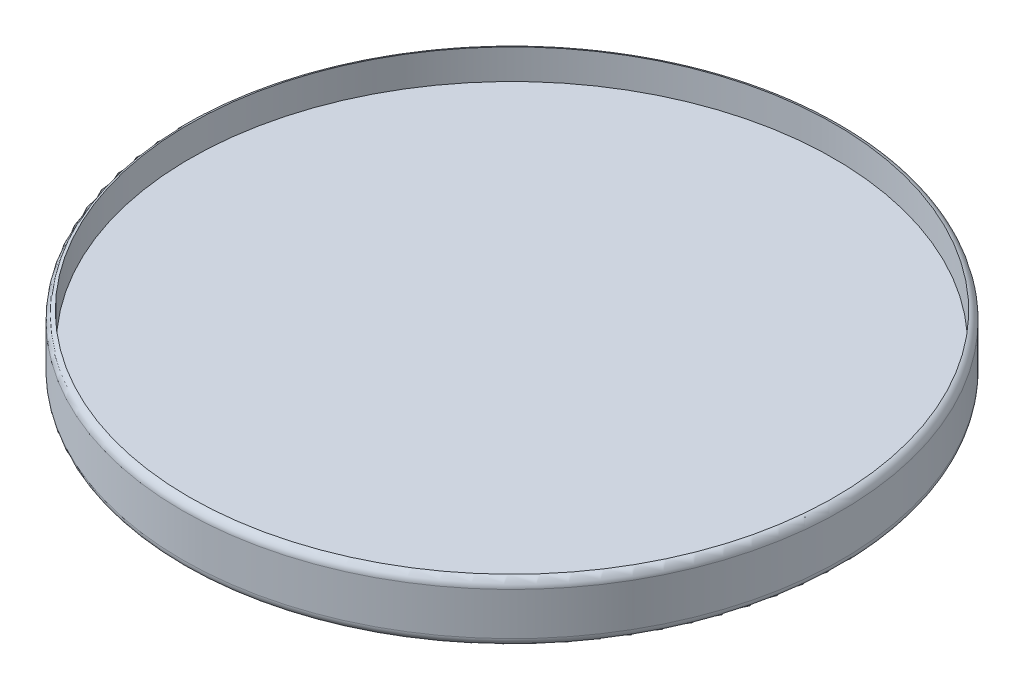
ISO-10303-21;
HEADER;
FILE_DESCRIPTION(('STEP AP214'),'2;1');
FILE_NAME('part.step','',(''),(''),'','','');
FILE_SCHEMA(('AUTOMOTIVE_DESIGN { 1 0 10303 214 1 1 1 1 }'));
ENDSEC;
DATA;
#1=APPLICATION_CONTEXT('core data for automotive mechanical design processes');
#2=APPLICATION_PROTOCOL_DEFINITION('international standard','automotive_design',2000,#1);
#3=PRODUCT_CONTEXT('',#1,'mechanical');
#4=PRODUCT('Part','Part','',(#3));
#5=PRODUCT_RELATED_PRODUCT_CATEGORY('part','',(#4));
#6=PRODUCT_DEFINITION_FORMATION('','',#4);
#7=PRODUCT_DEFINITION_CONTEXT('part definition',#1,'design');
#8=PRODUCT_DEFINITION('design','',#6,#7);
#9=PRODUCT_DEFINITION_SHAPE('','',#8);
#10=(LENGTH_UNIT() NAMED_UNIT(*) SI_UNIT(.MILLI.,.METRE.));
#11=(NAMED_UNIT(*) PLANE_ANGLE_UNIT() SI_UNIT($,.RADIAN.));
#12=(NAMED_UNIT(*) SI_UNIT($,.STERADIAN.) SOLID_ANGLE_UNIT());
#13=UNCERTAINTY_MEASURE_WITH_UNIT(LENGTH_MEASURE(1.E-05),#10,'distance_accuracy_value','');
#14=(GEOMETRIC_REPRESENTATION_CONTEXT(3) GLOBAL_UNCERTAINTY_ASSIGNED_CONTEXT((#13)) GLOBAL_UNIT_ASSIGNED_CONTEXT((#10,
#11,#12)) REPRESENTATION_CONTEXT('',''));
#15=CARTESIAN_POINT('',(0.,0.,0.));
#16=DIRECTION('',(0.,0.,1.));
#17=DIRECTION('',(1.,0.,0.));
#18=AXIS2_PLACEMENT_3D('',#15,#16,#17);
#19=CARTESIAN_POINT('',(0.,3.1242,0.));
#20=DIRECTION('',(0.,1.,0.));
#21=DIRECTION('',(0.,0.,1.));
#22=AXIS2_PLACEMENT_3D('',#19,#20,#21);
#23=PLANE('',#22);
#24=CARTESIAN_POINT('',(0.,3.1242,0.));
#25=DIRECTION('',(0.,1.,0.));
#26=DIRECTION('',(0.,0.,1.));
#27=AXIS2_PLACEMENT_3D('',#24,#25,#26);
#28=CIRCLE('',#27,46.5455);
#29=CARTESIAN_POINT('',(0.,3.1242,46.5455));
#30=VERTEX_POINT('',#29);
#31=EDGE_CURVE('E105',#30,#30,#28,.F.);
#32=ORIENTED_EDGE('',*,*,#31,.F.);
#33=EDGE_LOOP('',(#32));
#34=FACE_BOUND('',#33,.T.);
#35=CARTESIAN_POINT('',(0.,3.1242,0.));
#36=DIRECTION('',(0.,1.,0.));
#37=DIRECTION('',(0.,0.,1.));
#38=AXIS2_PLACEMENT_3D('',#35,#36,#37);
#39=CIRCLE('',#38,46.4312);
#40=CARTESIAN_POINT('',(0.,3.1242,46.4312));
#41=VERTEX_POINT('',#40);
#42=EDGE_CURVE('E93',#41,#41,#39,.T.);
#43=ORIENTED_EDGE('',*,*,#42,.F.);
#44=EDGE_LOOP('',(#43));
#45=FACE_BOUND('',#44,.T.);
#46=ADVANCED_FACE('F34',(#34,#45),#23,.T.);
#47=CARTESIAN_POINT('',(0.,3.1242,0.));
#48=DIRECTION('',(0.,-1.,0.));
#49=DIRECTION('',(0.,0.,-1.));
#50=AXIS2_PLACEMENT_3D('',#47,#48,#49);
#51=CYLINDRICAL_SURFACE('',#50,2.60858);
#52=CARTESIAN_POINT('',(0.,0.,0.));
#53=DIRECTION('',(0.,1.,0.));
#54=DIRECTION('',(0.,0.,1.));
#55=AXIS2_PLACEMENT_3D('',#52,#53,#54);
#56=CIRCLE('',#55,2.60858);
#57=CARTESIAN_POINT('',(-1.0811203944463,0.,2.37399838018316));
#58=VERTEX_POINT('',#57);
#59=CARTESIAN_POINT('',(2.17532997641621,0.,1.43966284598341));
#60=VERTEX_POINT('',#59);
#61=EDGE_CURVE('E108',#58,#60,#56,.T.);
#62=ORIENTED_EDGE('',*,*,#61,.F.);
#63=DIRECTION('',(0.,-1.,0.));
#64=VECTOR('',#63,1.);
#65=CARTESIAN_POINT('',(-1.0811203944463,3.1242,2.37399838018316));
#66=LINE('',#65,#64);
#67=CARTESIAN_POINT('',(-1.0811203944463,3.6322,2.37399838018316));
#68=VERTEX_POINT('',#67);
#69=EDGE_CURVE('E77',#68,#58,#66,.T.);
#70=ORIENTED_EDGE('',*,*,#69,.F.);
#71=CARTESIAN_POINT('',(0.,3.6322,0.));
#72=DIRECTION('',(0.,1.,0.));
#73=DIRECTION('',(0.,0.,1.));
#74=AXIS2_PLACEMENT_3D('',#71,#72,#73);
#75=CIRCLE('',#74,2.60858);
#76=CARTESIAN_POINT('',(2.17532997641621,3.6322,1.43966284598341));
#77=VERTEX_POINT('',#76);
#78=EDGE_CURVE('E75',#77,#68,#75,.F.);
#79=ORIENTED_EDGE('',*,*,#78,.F.);
#80=DIRECTION('',(0.,-1.,0.));
#81=VECTOR('',#80,1.);
#82=CARTESIAN_POINT('',(2.17532997641621,3.1242,1.43966284598341));
#83=LINE('',#82,#81);
#84=EDGE_CURVE('E49',#77,#60,#83,.T.);
#85=ORIENTED_EDGE('',*,*,#84,.T.);
#86=EDGE_LOOP('',(#62,#70,#79,#85));
#87=FACE_BOUND('',#86,.T.);
#88=ADVANCED_FACE('F76',(#87),#51,.F.);
#89=CARTESIAN_POINT('',(-1.62822518543126,3.1242,0.467167767099874));
#90=DIRECTION('',(0.961217619397613,0.,-0.275791022623264));
#91=DIRECTION('',(-0.275791022623264,0.,-0.961217619397613));
#92=AXIS2_PLACEMENT_3D('',#89,#90,#91);
#93=PLANE('',#92);
#94=DIRECTION('',(0.275791022623264,0.,0.961217619397613));
#95=VECTOR('',#94,1.);
#96=CARTESIAN_POINT('',(-1.62822518543126,0.,0.467167767099874));
#97=LINE('',#96,#95);
#98=CARTESIAN_POINT('',(-2.17532997641621,0.,-1.43966284598341));
#99=VERTEX_POINT('',#98);
#100=EDGE_CURVE('E110',#99,#58,#97,.T.);
#101=ORIENTED_EDGE('',*,*,#100,.F.);
#102=DIRECTION('',(0.,-1.,0.));
#103=VECTOR('',#102,1.);
#104=CARTESIAN_POINT('',(-2.17532997641621,3.1242,-1.43966284598341));
#105=LINE('',#104,#103);
#106=CARTESIAN_POINT('',(-2.17532997641621,3.6322,-1.43966284598341));
#107=VERTEX_POINT('',#106);
#108=EDGE_CURVE('E116',#107,#99,#105,.T.);
#109=ORIENTED_EDGE('',*,*,#108,.F.);
#110=DIRECTION('',(-0.275791022623264,0.,-0.961217619397613));
#111=VECTOR('',#110,1.);
#112=CARTESIAN_POINT('',(-1.62822518543126,3.6322,0.467167767099874));
#113=LINE('',#112,#111);
#114=EDGE_CURVE('E82',#68,#107,#113,.T.);
#115=ORIENTED_EDGE('',*,*,#114,.F.);
#116=ORIENTED_EDGE('',*,*,#69,.T.);
#117=EDGE_LOOP('',(#101,#109,#115,#116));
#118=FACE_BOUND('',#117,.T.);
#119=ADVANCED_FACE('F149',(#118),#93,.T.);
#120=CARTESIAN_POINT('',(1.08112039444631,0.,-2.37399838018316));
#121=VERTEX_POINT('',#120);
#122=EDGE_CURVE('E111',#121,#99,#56,.T.);
#123=ORIENTED_EDGE('',*,*,#122,.F.);
#124=DIRECTION('',(0.,-1.,0.));
#125=VECTOR('',#124,1.);
#126=CARTESIAN_POINT('',(1.08112039444631,3.1242,-2.37399838018316));
#127=LINE('',#126,#125);
#128=CARTESIAN_POINT('',(1.08112039444631,3.6322,-2.37399838018316));
#129=VERTEX_POINT('',#128);
#130=EDGE_CURVE('E57',#129,#121,#127,.T.);
#131=ORIENTED_EDGE('',*,*,#130,.F.);
#132=CARTESIAN_POINT('',(0.,3.6322,0.));
#133=DIRECTION('',(0.,1.,0.));
#134=DIRECTION('',(0.,0.,1.));
#135=AXIS2_PLACEMENT_3D('',#132,#133,#134);
#136=CIRCLE('',#135,2.60858);
#137=EDGE_CURVE('E92',#107,#129,#136,.F.);
#138=ORIENTED_EDGE('',*,*,#137,.F.);
#139=ORIENTED_EDGE('',*,*,#108,.T.);
#140=EDGE_LOOP('',(#123,#131,#138,#139));
#141=FACE_BOUND('',#140,.T.);
#142=ADVANCED_FACE('F151',(#141),#51,.F.);
#143=CARTESIAN_POINT('',(1.62822518543126,3.1242,-0.467167767099874));
#144=DIRECTION('',(-0.961217619397613,0.,0.275791022623264));
#145=DIRECTION('',(0.275791022623264,0.,0.961217619397613));
#146=AXIS2_PLACEMENT_3D('',#143,#144,#145);
#147=PLANE('',#146);
#148=DIRECTION('',(-0.275791022623264,0.,-0.961217619397613));
#149=VECTOR('',#148,1.);
#150=CARTESIAN_POINT('',(1.62822518543126,0.,-0.467167767099874));
#151=LINE('',#150,#149);
#152=EDGE_CURVE('E88',#60,#121,#151,.T.);
#153=ORIENTED_EDGE('',*,*,#152,.F.);
#154=ORIENTED_EDGE('',*,*,#84,.F.);
#155=DIRECTION('',(0.275791022623264,0.,0.961217619397613));
#156=VECTOR('',#155,1.);
#157=CARTESIAN_POINT('',(1.62822518543126,3.6322,-0.467167767099874));
#158=LINE('',#157,#156);
#159=EDGE_CURVE('E83',#129,#77,#158,.T.);
#160=ORIENTED_EDGE('',*,*,#159,.F.);
#161=ORIENTED_EDGE('',*,*,#130,.T.);
#162=EDGE_LOOP('',(#153,#154,#160,#161));
#163=FACE_BOUND('',#162,.T.);
#164=ADVANCED_FACE('F85',(#163),#147,.T.);
#165=CARTESIAN_POINT('',(0.,0.,0.));
#166=DIRECTION('',(0.,1.,0.));
#167=DIRECTION('',(0.,0.,1.));
#168=AXIS2_PLACEMENT_3D('',#165,#166,#167);
#169=PLANE('',#168);
#170=CARTESIAN_POINT('',(0.,0.,0.));
#171=DIRECTION('',(0.,1.,0.));
#172=DIRECTION('',(0.,0.,1.));
#173=AXIS2_PLACEMENT_3D('',#170,#171,#172);
#174=CIRCLE('',#173,46.228);
#175=CARTESIAN_POINT('',(0.,0.,46.228));
#176=VERTEX_POINT('',#175);
#177=EDGE_CURVE('E42',#176,#176,#174,.F.);
#178=ORIENTED_EDGE('',*,*,#177,.T.);
#179=EDGE_LOOP('',(#178));
#180=FACE_BOUND('',#179,.T.);
#181=ORIENTED_EDGE('',*,*,#61,.T.);
#182=ORIENTED_EDGE('',*,*,#152,.T.);
#183=ORIENTED_EDGE('',*,*,#122,.T.);
#184=ORIENTED_EDGE('',*,*,#100,.T.);
#185=EDGE_LOOP('',(#181,#182,#183,#184));
#186=FACE_BOUND('',#185,.T.);
#187=ADVANCED_FACE('F124',(#180,#186),#169,.F.);
#188=CARTESIAN_POINT('',(0.,8.636,0.));
#189=DIRECTION('',(0.,-1.,0.));
#190=DIRECTION('',(0.,0.,-1.));
#191=AXIS2_PLACEMENT_3D('',#188,#189,#190);
#192=CYLINDRICAL_SURFACE('',#191,46.5455);
#193=ORIENTED_EDGE('',*,*,#31,.T.);
#194=EDGE_LOOP('',(#193));
#195=FACE_BOUND('',#194,.T.);
#196=CARTESIAN_POINT('',(0.,8.636,0.));
#197=DIRECTION('',(0.,1.,0.));
#198=DIRECTION('',(0.,0.,1.));
#199=AXIS2_PLACEMENT_3D('',#196,#197,#198);
#200=CIRCLE('',#199,46.5455);
#201=CARTESIAN_POINT('',(0.,8.636,46.5455));
#202=VERTEX_POINT('',#201);
#203=EDGE_CURVE('E101',#202,#202,#200,.T.);
#204=ORIENTED_EDGE('',*,*,#203,.T.);
#205=EDGE_LOOP('',(#204));
#206=FACE_BOUND('',#205,.T.);
#207=ADVANCED_FACE('F134',(#195,#206),#192,.F.);
#208=CARTESIAN_POINT('',(0.,8.636,0.));
#209=DIRECTION('',(0.,-1.,0.));
#210=DIRECTION('',(0.,0.,-1.));
#211=AXIS2_PLACEMENT_3D('',#208,#209,#210);
#212=CYLINDRICAL_SURFACE('',#211,47.498);
#213=CARTESIAN_POINT('',(0.,7.40632778757914,0.));
#214=DIRECTION('',(0.,1.,0.));
#215=DIRECTION('',(0.,0.,1.));
#216=AXIS2_PLACEMENT_3D('',#213,#214,#215);
#217=CIRCLE('',#216,47.498);
#218=CARTESIAN_POINT('',(0.,7.40632778757914,47.498));
#219=VERTEX_POINT('',#218);
#220=EDGE_CURVE('E11',#219,#219,#217,.F.);
#221=ORIENTED_EDGE('',*,*,#220,.T.);
#222=EDGE_LOOP('',(#221));
#223=FACE_BOUND('',#222,.T.);
#224=CARTESIAN_POINT('',(0.,1.27,0.));
#225=DIRECTION('',(0.,1.,0.));
#226=DIRECTION('',(0.,0.,1.));
#227=AXIS2_PLACEMENT_3D('',#224,#225,#226);
#228=CIRCLE('',#227,47.498);
#229=CARTESIAN_POINT('',(0.,1.27,47.498));
#230=VERTEX_POINT('',#229);
#231=EDGE_CURVE('E119',#230,#230,#228,.T.);
#232=ORIENTED_EDGE('',*,*,#231,.T.);
#233=EDGE_LOOP('',(#232));
#234=FACE_BOUND('',#233,.T.);
#235=ADVANCED_FACE('F130',(#223,#234),#212,.T.);
#236=CARTESIAN_POINT('',(0.,1.27,0.));
#237=DIRECTION('',(0.,1.,0.));
#238=DIRECTION('',(0.,0.,1.));
#239=AXIS2_PLACEMENT_3D('',#236,#237,#238);
#240=TOROIDAL_SURFACE('',#239,46.228,1.27);
#241=ORIENTED_EDGE('',*,*,#177,.F.);
#242=EDGE_LOOP('',(#241));
#243=FACE_BOUND('',#242,.T.);
#244=ORIENTED_EDGE('',*,*,#231,.F.);
#245=EDGE_LOOP('',(#244));
#246=FACE_BOUND('',#245,.T.);
#247=ADVANCED_FACE('F127',(#243,#246),#240,.T.);
#248=CARTESIAN_POINT('',(0.,7.40632778757914,0.));
#249=DIRECTION('',(0.,1.,0.));
#250=DIRECTION('',(0.,0.,1.));
#251=AXIS2_PLACEMENT_3D('',#248,#249,#250);
#252=TOROIDAL_SURFACE('',#251,46.228,1.27);
#253=ORIENTED_EDGE('',*,*,#220,.F.);
#254=EDGE_LOOP('',(#253));
#255=FACE_BOUND('',#254,.T.);
#256=ORIENTED_EDGE('',*,*,#203,.F.);
#257=EDGE_LOOP('',(#256));
#258=FACE_BOUND('',#257,.T.);
#259=ADVANCED_FACE('F36',(#255,#258),#252,.T.);
#260=CARTESIAN_POINT('',(0.,3.6322,0.));
#261=DIRECTION('',(0.,-1.,0.));
#262=DIRECTION('',(0.,0.,-1.));
#263=AXIS2_PLACEMENT_3D('',#260,#261,#262);
#264=CYLINDRICAL_SURFACE('',#263,46.4312);
#265=ORIENTED_EDGE('',*,*,#42,.T.);
#266=EDGE_LOOP('',(#265));
#267=FACE_BOUND('',#266,.T.);
#268=CARTESIAN_POINT('',(0.,4.3942,0.));
#269=DIRECTION('',(0.,1.,0.));
#270=DIRECTION('',(0.,0.,1.));
#271=AXIS2_PLACEMENT_3D('',#268,#269,#270);
#272=CIRCLE('',#271,46.4312);
#273=CARTESIAN_POINT('',(0.,4.3942,46.4312));
#274=VERTEX_POINT('',#273);
#275=EDGE_CURVE('E96',#274,#274,#272,.T.);
#276=ORIENTED_EDGE('',*,*,#275,.F.);
#277=EDGE_LOOP('',(#276));
#278=FACE_BOUND('',#277,.T.);
#279=ADVANCED_FACE('F208',(#267,#278),#264,.T.);
#280=CARTESIAN_POINT('',(0.,4.3942,0.));
#281=DIRECTION('',(0.,1.,0.));
#282=DIRECTION('',(0.,0.,1.));
#283=AXIS2_PLACEMENT_3D('',#280,#281,#282);
#284=PLANE('',#283);
#285=ORIENTED_EDGE('',*,*,#275,.T.);
#286=EDGE_LOOP('',(#285));
#287=FACE_BOUND('',#286,.T.);
#288=ADVANCED_FACE('F248',(#287),#284,.T.);
#289=CARTESIAN_POINT('',(0.,3.6322,0.));
#290=DIRECTION('',(0.,1.,0.));
#291=DIRECTION('',(0.,0.,1.));
#292=AXIS2_PLACEMENT_3D('',#289,#290,#291);
#293=PLANE('',#292);
#294=ORIENTED_EDGE('',*,*,#78,.T.);
#295=ORIENTED_EDGE('',*,*,#114,.T.);
#296=ORIENTED_EDGE('',*,*,#137,.T.);
#297=ORIENTED_EDGE('',*,*,#159,.T.);
#298=EDGE_LOOP('',(#294,#295,#296,#297));
#299=FACE_BOUND('',#298,.T.);
#300=ADVANCED_FACE('F90',(#299),#293,.F.);
#301=CLOSED_SHELL('',(#46,#88,#119,#142,#164,#187,#207,#235,#247,#259,#279,#288,#300));
#302=MANIFOLD_SOLID_BREP('B2',#301);
#303=ADVANCED_BREP_SHAPE_REPRESENTATION('',(#18,#302),#14);
#304=SHAPE_DEFINITION_REPRESENTATION(#9,#303);
ENDSEC;
END-ISO-10303-21;
